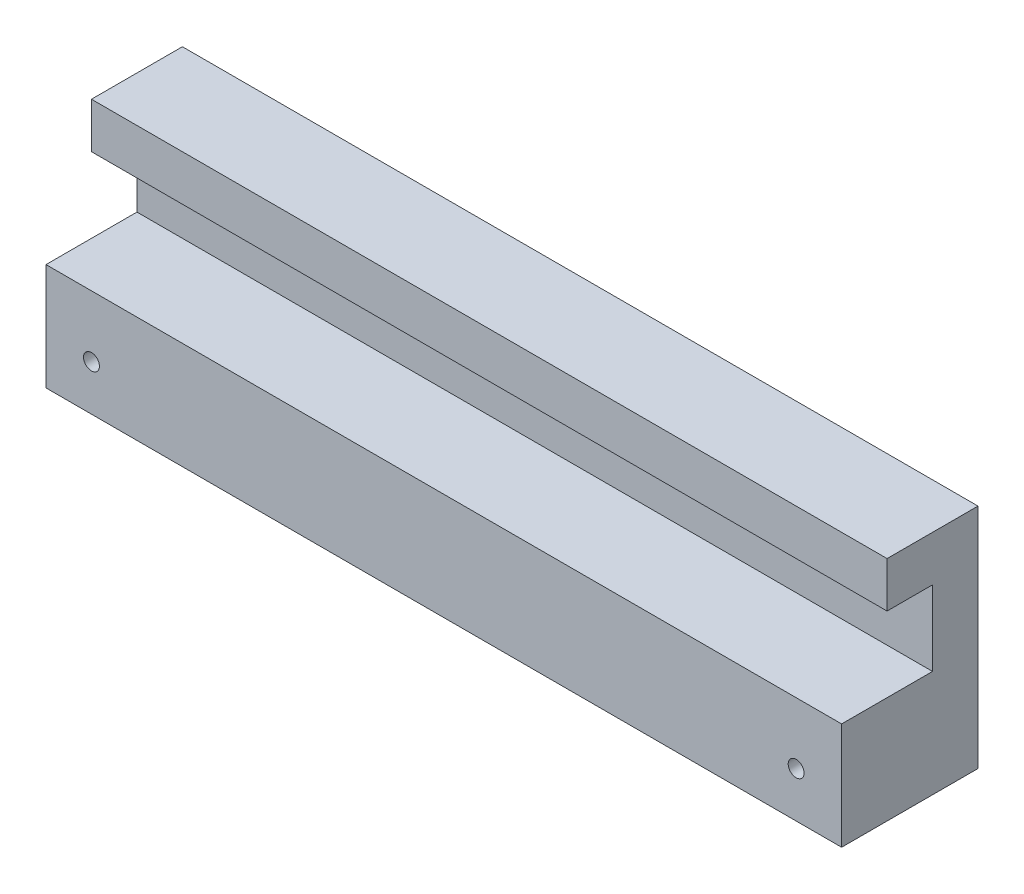
ISO-10303-21;
HEADER;
FILE_DESCRIPTION(('STEP AP214'),'2;1');
FILE_NAME('part.step','',(''),(''),'','','');
FILE_SCHEMA(('AUTOMOTIVE_DESIGN { 1 0 10303 214 1 1 1 1 }'));
ENDSEC;
DATA;
#1=APPLICATION_CONTEXT('core data for automotive mechanical design processes');
#2=APPLICATION_PROTOCOL_DEFINITION('international standard','automotive_design',2000,#1);
#3=PRODUCT_CONTEXT('',#1,'mechanical');
#4=PRODUCT('Part','Part','',(#3));
#5=PRODUCT_RELATED_PRODUCT_CATEGORY('part','',(#4));
#6=PRODUCT_DEFINITION_FORMATION('','',#4);
#7=PRODUCT_DEFINITION_CONTEXT('part definition',#1,'design');
#8=PRODUCT_DEFINITION('design','',#6,#7);
#9=PRODUCT_DEFINITION_SHAPE('','',#8);
#10=(LENGTH_UNIT() NAMED_UNIT(*) SI_UNIT(.MILLI.,.METRE.));
#11=(NAMED_UNIT(*) PLANE_ANGLE_UNIT() SI_UNIT($,.RADIAN.));
#12=(NAMED_UNIT(*) SI_UNIT($,.STERADIAN.) SOLID_ANGLE_UNIT());
#13=UNCERTAINTY_MEASURE_WITH_UNIT(LENGTH_MEASURE(1.E-05),#10,'distance_accuracy_value','');
#14=(GEOMETRIC_REPRESENTATION_CONTEXT(3) GLOBAL_UNCERTAINTY_ASSIGNED_CONTEXT((#13)) GLOBAL_UNIT_ASSIGNED_CONTEXT((#10,
#11,#12)) REPRESENTATION_CONTEXT('',''));
#15=CARTESIAN_POINT('',(0.,0.,0.));
#16=DIRECTION('',(0.,0.,1.));
#17=DIRECTION('',(1.,0.,0.));
#18=AXIS2_PLACEMENT_3D('',#15,#16,#17);
#19=CARTESIAN_POINT('',(-17.5,5.,2.));
#20=DIRECTION('',(1.,0.,0.));
#21=DIRECTION('',(0.,0.,-1.));
#22=AXIS2_PLACEMENT_3D('',#19,#20,#21);
#23=PLANE('',#22);
#24=DIRECTION('',(0.,-1.,0.));
#25=VECTOR('',#24,1.);
#26=CARTESIAN_POINT('',(-17.5,5.,0.));
#27=LINE('',#26,#25);
#28=CARTESIAN_POINT('',(-17.5,5.,0.));
#29=VERTEX_POINT('',#28);
#30=CARTESIAN_POINT('',(-17.5,-5.,0.));
#31=VERTEX_POINT('',#30);
#32=EDGE_CURVE('E151',#29,#31,#27,.T.);
#33=ORIENTED_EDGE('',*,*,#32,.T.);
#34=DIRECTION('',(0.,0.,-1.));
#35=VECTOR('',#34,1.);
#36=CARTESIAN_POINT('',(-17.5,-5.,2.));
#37=LINE('',#36,#35);
#38=CARTESIAN_POINT('',(-17.5,-5.,6.));
#39=VERTEX_POINT('',#38);
#40=EDGE_CURVE('E11',#39,#31,#37,.T.);
#41=ORIENTED_EDGE('',*,*,#40,.F.);
#42=DIRECTION('',(0.,1.,0.));
#43=VECTOR('',#42,1.);
#44=CARTESIAN_POINT('',(-17.5,-5.,6.));
#45=LINE('',#44,#43);
#46=CARTESIAN_POINT('',(-17.5,-0.3,6.));
#47=VERTEX_POINT('',#46);
#48=EDGE_CURVE('E116',#39,#47,#45,.T.);
#49=ORIENTED_EDGE('',*,*,#48,.T.);
#50=DIRECTION('',(0.,0.,-1.));
#51=VECTOR('',#50,1.);
#52=CARTESIAN_POINT('',(-17.5,-0.3,6.));
#53=LINE('',#52,#51);
#54=CARTESIAN_POINT('',(-17.5,-0.3,2.));
#55=VERTEX_POINT('',#54);
#56=EDGE_CURVE('E102',#47,#55,#53,.T.);
#57=ORIENTED_EDGE('',*,*,#56,.T.);
#58=DIRECTION('',(0.,-1.,0.));
#59=VECTOR('',#58,1.);
#60=CARTESIAN_POINT('',(-17.5,5.,2.));
#61=LINE('',#60,#59);
#62=CARTESIAN_POINT('',(-17.5,3.,2.));
#63=VERTEX_POINT('',#62);
#64=EDGE_CURVE('E152',#63,#55,#61,.T.);
#65=ORIENTED_EDGE('',*,*,#64,.F.);
#66=DIRECTION('',(0.,0.,-1.));
#67=VECTOR('',#66,1.);
#68=CARTESIAN_POINT('',(-17.5,3.,4.));
#69=LINE('',#68,#67);
#70=CARTESIAN_POINT('',(-17.5,3.,4.));
#71=VERTEX_POINT('',#70);
#72=EDGE_CURVE('E148',#71,#63,#69,.T.);
#73=ORIENTED_EDGE('',*,*,#72,.F.);
#74=DIRECTION('',(0.,-1.,0.));
#75=VECTOR('',#74,1.);
#76=CARTESIAN_POINT('',(-17.5,5.,4.));
#77=LINE('',#76,#75);
#78=CARTESIAN_POINT('',(-17.5,5.,4.));
#79=VERTEX_POINT('',#78);
#80=EDGE_CURVE('E133',#79,#71,#77,.T.);
#81=ORIENTED_EDGE('',*,*,#80,.F.);
#82=DIRECTION('',(0.,0.,-1.));
#83=VECTOR('',#82,1.);
#84=CARTESIAN_POINT('',(-17.5,5.,2.));
#85=LINE('',#84,#83);
#86=EDGE_CURVE('E157',#79,#29,#85,.T.);
#87=ORIENTED_EDGE('',*,*,#86,.T.);
#88=EDGE_LOOP('',(#33,#41,#49,#57,#65,#73,#81,#87));
#89=FACE_BOUND('',#88,.T.);
#90=ADVANCED_FACE('F39',(#89),#23,.F.);
#91=CARTESIAN_POINT('',(-17.5,-5.,2.));
#92=DIRECTION('',(0.,1.,0.));
#93=DIRECTION('',(0.,0.,1.));
#94=AXIS2_PLACEMENT_3D('',#91,#92,#93);
#95=PLANE('',#94);
#96=DIRECTION('',(1.,0.,0.));
#97=VECTOR('',#96,1.);
#98=CARTESIAN_POINT('',(-17.5,-5.,0.));
#99=LINE('',#98,#97);
#100=CARTESIAN_POINT('',(17.5,-5.,0.));
#101=VERTEX_POINT('',#100);
#102=EDGE_CURVE('E159',#31,#101,#99,.T.);
#103=ORIENTED_EDGE('',*,*,#102,.T.);
#104=DIRECTION('',(0.,0.,-1.));
#105=VECTOR('',#104,1.);
#106=CARTESIAN_POINT('',(17.5,-5.,2.));
#107=LINE('',#106,#105);
#108=CARTESIAN_POINT('',(17.5,-5.,6.));
#109=VERTEX_POINT('',#108);
#110=EDGE_CURVE('E46',#109,#101,#107,.T.);
#111=ORIENTED_EDGE('',*,*,#110,.F.);
#112=DIRECTION('',(1.,0.,0.));
#113=VECTOR('',#112,1.);
#114=CARTESIAN_POINT('',(-17.5,-5.,6.));
#115=LINE('',#114,#113);
#116=EDGE_CURVE('E110',#39,#109,#115,.T.);
#117=ORIENTED_EDGE('',*,*,#116,.F.);
#118=ORIENTED_EDGE('',*,*,#40,.T.);
#119=EDGE_LOOP('',(#103,#111,#117,#118));
#120=FACE_BOUND('',#119,.T.);
#121=ADVANCED_FACE('F173',(#120),#95,.F.);
#122=CARTESIAN_POINT('',(17.5,5.,2.));
#123=DIRECTION('',(1.,0.,0.));
#124=DIRECTION('',(0.,0.,-1.));
#125=AXIS2_PLACEMENT_3D('',#122,#123,#124);
#126=PLANE('',#125);
#127=DIRECTION('',(0.,-1.,0.));
#128=VECTOR('',#127,1.);
#129=CARTESIAN_POINT('',(17.5,5.,0.));
#130=LINE('',#129,#128);
#131=CARTESIAN_POINT('',(17.5,5.,0.));
#132=VERTEX_POINT('',#131);
#133=EDGE_CURVE('E162',#132,#101,#130,.T.);
#134=ORIENTED_EDGE('',*,*,#133,.F.);
#135=DIRECTION('',(0.,0.,-1.));
#136=VECTOR('',#135,1.);
#137=CARTESIAN_POINT('',(17.5,5.,2.));
#138=LINE('',#137,#136);
#139=CARTESIAN_POINT('',(17.5,5.,4.));
#140=VERTEX_POINT('',#139);
#141=EDGE_CURVE('E168',#140,#132,#138,.T.);
#142=ORIENTED_EDGE('',*,*,#141,.F.);
#143=DIRECTION('',(0.,-1.,0.));
#144=VECTOR('',#143,1.);
#145=CARTESIAN_POINT('',(17.5,5.,4.));
#146=LINE('',#145,#144);
#147=CARTESIAN_POINT('',(17.5,3.,4.));
#148=VERTEX_POINT('',#147);
#149=EDGE_CURVE('E138',#140,#148,#146,.T.);
#150=ORIENTED_EDGE('',*,*,#149,.T.);
#151=DIRECTION('',(0.,0.,-1.));
#152=VECTOR('',#151,1.);
#153=CARTESIAN_POINT('',(17.5,3.,4.));
#154=LINE('',#153,#152);
#155=CARTESIAN_POINT('',(17.5,3.,2.));
#156=VERTEX_POINT('',#155);
#157=EDGE_CURVE('E144',#148,#156,#154,.T.);
#158=ORIENTED_EDGE('',*,*,#157,.T.);
#159=DIRECTION('',(0.,-1.,0.));
#160=VECTOR('',#159,1.);
#161=CARTESIAN_POINT('',(17.5,5.,2.));
#162=LINE('',#161,#160);
#163=CARTESIAN_POINT('',(17.5,-0.3,2.));
#164=VERTEX_POINT('',#163);
#165=EDGE_CURVE('E154',#156,#164,#162,.T.);
#166=ORIENTED_EDGE('',*,*,#165,.T.);
#167=DIRECTION('',(0.,0.,-1.));
#168=VECTOR('',#167,1.);
#169=CARTESIAN_POINT('',(17.5,-0.3,6.));
#170=LINE('',#169,#168);
#171=CARTESIAN_POINT('',(17.5,-0.3,6.));
#172=VERTEX_POINT('',#171);
#173=EDGE_CURVE('E109',#172,#164,#170,.T.);
#174=ORIENTED_EDGE('',*,*,#173,.F.);
#175=DIRECTION('',(0.,1.,0.));
#176=VECTOR('',#175,1.);
#177=CARTESIAN_POINT('',(17.5,-5.,6.));
#178=LINE('',#177,#176);
#179=EDGE_CURVE('E118',#109,#172,#178,.T.);
#180=ORIENTED_EDGE('',*,*,#179,.F.);
#181=ORIENTED_EDGE('',*,*,#110,.T.);
#182=EDGE_LOOP('',(#134,#142,#150,#158,#166,#174,#180,#181));
#183=FACE_BOUND('',#182,.T.);
#184=ADVANCED_FACE('F171',(#183),#126,.T.);
#185=CARTESIAN_POINT('',(-17.5,5.,2.));
#186=DIRECTION('',(0.,1.,0.));
#187=DIRECTION('',(0.,0.,1.));
#188=AXIS2_PLACEMENT_3D('',#185,#186,#187);
#189=PLANE('',#188);
#190=DIRECTION('',(1.,0.,0.));
#191=VECTOR('',#190,1.);
#192=CARTESIAN_POINT('',(-17.5,5.,0.));
#193=LINE('',#192,#191);
#194=EDGE_CURVE('E155',#29,#132,#193,.T.);
#195=ORIENTED_EDGE('',*,*,#194,.F.);
#196=ORIENTED_EDGE('',*,*,#86,.F.);
#197=DIRECTION('',(1.,0.,0.));
#198=VECTOR('',#197,1.);
#199=CARTESIAN_POINT('',(-17.5,5.,4.));
#200=LINE('',#199,#198);
#201=EDGE_CURVE('E141',#79,#140,#200,.T.);
#202=ORIENTED_EDGE('',*,*,#201,.T.);
#203=ORIENTED_EDGE('',*,*,#141,.T.);
#204=EDGE_LOOP('',(#195,#196,#202,#203));
#205=FACE_BOUND('',#204,.T.);
#206=ADVANCED_FACE('F179',(#205),#189,.T.);
#207=CARTESIAN_POINT('',(0.,0.,2.));
#208=DIRECTION('',(0.,0.,1.));
#209=DIRECTION('',(1.,0.,0.));
#210=AXIS2_PLACEMENT_3D('',#207,#208,#209);
#211=PLANE('',#210);
#212=DIRECTION('',(1.,0.,0.));
#213=VECTOR('',#212,1.);
#214=CARTESIAN_POINT('',(-17.5,-0.3,2.));
#215=LINE('',#214,#213);
#216=EDGE_CURVE('E53',#55,#164,#215,.T.);
#217=ORIENTED_EDGE('',*,*,#216,.T.);
#218=ORIENTED_EDGE('',*,*,#165,.F.);
#219=DIRECTION('',(1.,0.,0.));
#220=VECTOR('',#219,1.);
#221=CARTESIAN_POINT('',(-17.5,3.,2.));
#222=LINE('',#221,#220);
#223=EDGE_CURVE('E58',#63,#156,#222,.T.);
#224=ORIENTED_EDGE('',*,*,#223,.F.);
#225=ORIENTED_EDGE('',*,*,#64,.T.);
#226=EDGE_LOOP('',(#217,#218,#224,#225));
#227=FACE_BOUND('',#226,.T.);
#228=ADVANCED_FACE('F189',(#227),#211,.T.);
#229=CARTESIAN_POINT('',(0.,0.,0.));
#230=DIRECTION('',(0.,0.,1.));
#231=DIRECTION('',(1.,0.,0.));
#232=AXIS2_PLACEMENT_3D('',#229,#230,#231);
#233=PLANE('',#232);
#234=CARTESIAN_POINT('',(15.5,-3.,0.));
#235=DIRECTION('',(0.,0.,1.));
#236=DIRECTION('',(1.,0.,0.));
#237=AXIS2_PLACEMENT_3D('',#234,#235,#236);
#238=CIRCLE('',#237,0.349999999999999);
#239=CARTESIAN_POINT('',(15.85,-3.,0.));
#240=VERTEX_POINT('',#239);
#241=EDGE_CURVE('E124',#240,#240,#238,.T.);
#242=ORIENTED_EDGE('',*,*,#241,.T.);
#243=EDGE_LOOP('',(#242));
#244=FACE_BOUND('',#243,.T.);
#245=CARTESIAN_POINT('',(-15.5,-3.,0.));
#246=DIRECTION('',(0.,0.,1.));
#247=DIRECTION('',(1.,0.,0.));
#248=AXIS2_PLACEMENT_3D('',#245,#246,#247);
#249=CIRCLE('',#248,0.349999999999999);
#250=CARTESIAN_POINT('',(-15.15,-3.,0.));
#251=VERTEX_POINT('',#250);
#252=EDGE_CURVE('E127',#251,#251,#249,.T.);
#253=ORIENTED_EDGE('',*,*,#252,.T.);
#254=EDGE_LOOP('',(#253));
#255=FACE_BOUND('',#254,.T.);
#256=ORIENTED_EDGE('',*,*,#32,.F.);
#257=ORIENTED_EDGE('',*,*,#194,.T.);
#258=ORIENTED_EDGE('',*,*,#133,.T.);
#259=ORIENTED_EDGE('',*,*,#102,.F.);
#260=EDGE_LOOP('',(#256,#257,#258,#259));
#261=FACE_BOUND('',#260,.T.);
#262=ADVANCED_FACE('F176',(#244,#255,#261),#233,.F.);
#263=CARTESIAN_POINT('',(-17.5,3.,4.));
#264=DIRECTION('',(0.,1.,0.));
#265=DIRECTION('',(0.,0.,1.));
#266=AXIS2_PLACEMENT_3D('',#263,#264,#265);
#267=PLANE('',#266);
#268=ORIENTED_EDGE('',*,*,#223,.T.);
#269=ORIENTED_EDGE('',*,*,#157,.F.);
#270=DIRECTION('',(1.,0.,0.));
#271=VECTOR('',#270,1.);
#272=CARTESIAN_POINT('',(-17.5,3.,4.));
#273=LINE('',#272,#271);
#274=EDGE_CURVE('E136',#71,#148,#273,.T.);
#275=ORIENTED_EDGE('',*,*,#274,.F.);
#276=ORIENTED_EDGE('',*,*,#72,.T.);
#277=EDGE_LOOP('',(#268,#269,#275,#276));
#278=FACE_BOUND('',#277,.T.);
#279=ADVANCED_FACE('F188',(#278),#267,.F.);
#280=CARTESIAN_POINT('',(0.,0.,4.));
#281=DIRECTION('',(0.,0.,1.));
#282=DIRECTION('',(1.,0.,0.));
#283=AXIS2_PLACEMENT_3D('',#280,#281,#282);
#284=PLANE('',#283);
#285=ORIENTED_EDGE('',*,*,#80,.T.);
#286=ORIENTED_EDGE('',*,*,#274,.T.);
#287=ORIENTED_EDGE('',*,*,#149,.F.);
#288=ORIENTED_EDGE('',*,*,#201,.F.);
#289=EDGE_LOOP('',(#285,#286,#287,#288));
#290=FACE_BOUND('',#289,.T.);
#291=ADVANCED_FACE('F184',(#290),#284,.T.);
#292=CARTESIAN_POINT('',(-17.5,-0.3,6.));
#293=DIRECTION('',(0.,1.,0.));
#294=DIRECTION('',(0.,0.,1.));
#295=AXIS2_PLACEMENT_3D('',#292,#293,#294);
#296=PLANE('',#295);
#297=ORIENTED_EDGE('',*,*,#216,.F.);
#298=ORIENTED_EDGE('',*,*,#56,.F.);
#299=DIRECTION('',(1.,0.,0.));
#300=VECTOR('',#299,1.);
#301=CARTESIAN_POINT('',(-17.5,-0.3,6.));
#302=LINE('',#301,#300);
#303=EDGE_CURVE('E106',#47,#172,#302,.T.);
#304=ORIENTED_EDGE('',*,*,#303,.T.);
#305=ORIENTED_EDGE('',*,*,#173,.T.);
#306=EDGE_LOOP('',(#297,#298,#304,#305));
#307=FACE_BOUND('',#306,.T.);
#308=ADVANCED_FACE('F104',(#307),#296,.T.);
#309=CARTESIAN_POINT('',(0.,0.,6.));
#310=DIRECTION('',(0.,0.,-1.));
#311=DIRECTION('',(-1.,0.,0.));
#312=AXIS2_PLACEMENT_3D('',#309,#310,#311);
#313=PLANE('',#312);
#314=CARTESIAN_POINT('',(15.5,-3.,6.));
#315=DIRECTION('',(0.,0.,1.));
#316=DIRECTION('',(1.,0.,0.));
#317=AXIS2_PLACEMENT_3D('',#314,#315,#316);
#318=CIRCLE('',#317,0.349999999999999);
#319=CARTESIAN_POINT('',(15.85,-3.,6.));
#320=VERTEX_POINT('',#319);
#321=EDGE_CURVE('E307',#320,#320,#318,.T.);
#322=ORIENTED_EDGE('',*,*,#321,.F.);
#323=EDGE_LOOP('',(#322));
#324=FACE_BOUND('',#323,.T.);
#325=CARTESIAN_POINT('',(-15.5,-3.,6.));
#326=DIRECTION('',(0.,0.,1.));
#327=DIRECTION('',(1.,0.,0.));
#328=AXIS2_PLACEMENT_3D('',#325,#326,#327);
#329=CIRCLE('',#328,0.349999999999999);
#330=CARTESIAN_POINT('',(-15.15,-3.,6.));
#331=VERTEX_POINT('',#330);
#332=EDGE_CURVE('E308',#331,#331,#329,.T.);
#333=ORIENTED_EDGE('',*,*,#332,.F.);
#334=EDGE_LOOP('',(#333));
#335=FACE_BOUND('',#334,.T.);
#336=ORIENTED_EDGE('',*,*,#48,.F.);
#337=ORIENTED_EDGE('',*,*,#116,.T.);
#338=ORIENTED_EDGE('',*,*,#179,.T.);
#339=ORIENTED_EDGE('',*,*,#303,.F.);
#340=EDGE_LOOP('',(#336,#337,#338,#339));
#341=FACE_BOUND('',#340,.T.);
#342=ADVANCED_FACE('F114',(#324,#335,#341),#313,.F.);
#343=CARTESIAN_POINT('',(-15.5,-3.,0.));
#344=DIRECTION('',(0.,0.,1.));
#345=DIRECTION('',(1.,0.,0.));
#346=AXIS2_PLACEMENT_3D('',#343,#344,#345);
#347=CYLINDRICAL_SURFACE('',#346,0.349999999999999);
#348=ORIENTED_EDGE('',*,*,#252,.F.);
#349=EDGE_LOOP('',(#348));
#350=FACE_BOUND('',#349,.T.);
#351=ORIENTED_EDGE('',*,*,#332,.T.);
#352=EDGE_LOOP('',(#351));
#353=FACE_BOUND('',#352,.T.);
#354=ADVANCED_FACE('F273',(#350,#353),#347,.F.);
#355=CARTESIAN_POINT('',(15.5,-3.,0.));
#356=DIRECTION('',(0.,0.,1.));
#357=DIRECTION('',(1.,0.,0.));
#358=AXIS2_PLACEMENT_3D('',#355,#356,#357);
#359=CYLINDRICAL_SURFACE('',#358,0.349999999999999);
#360=ORIENTED_EDGE('',*,*,#241,.F.);
#361=EDGE_LOOP('',(#360));
#362=FACE_BOUND('',#361,.T.);
#363=ORIENTED_EDGE('',*,*,#321,.T.);
#364=EDGE_LOOP('',(#363));
#365=FACE_BOUND('',#364,.T.);
#366=ADVANCED_FACE('F284',(#362,#365),#359,.F.);
#367=CLOSED_SHELL('',(#90,#121,#184,#206,#228,#262,#279,#291,#308,#342,#354,#366));
#368=MANIFOLD_SOLID_BREP('B2',#367);
#369=ADVANCED_BREP_SHAPE_REPRESENTATION('',(#18,#368),#14);
#370=SHAPE_DEFINITION_REPRESENTATION(#9,#369);
ENDSEC;
END-ISO-10303-21;
